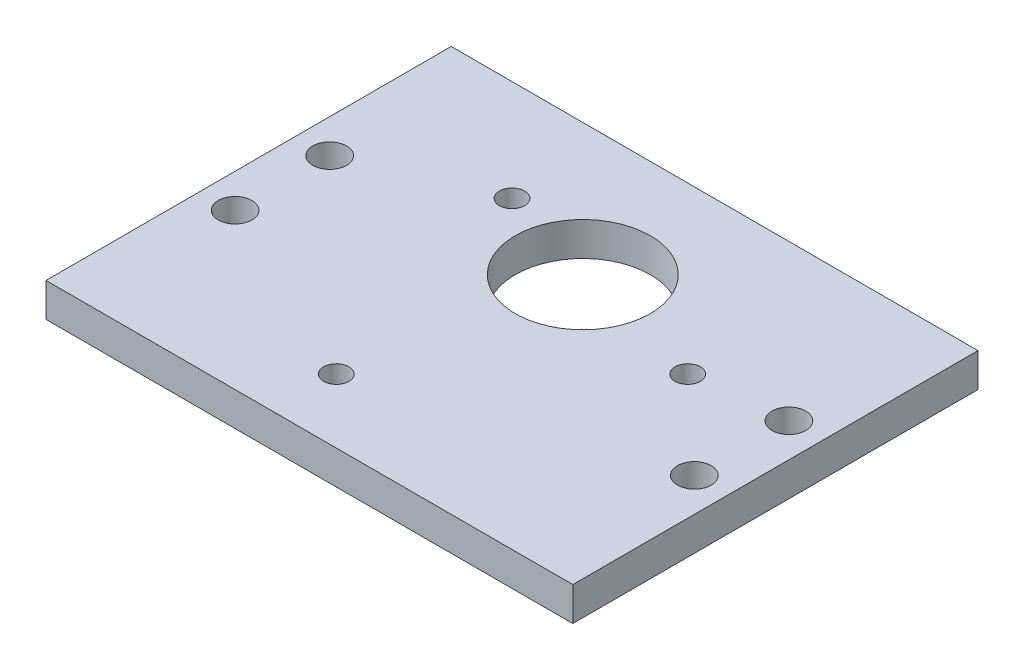
ISO-10303-21;
HEADER;
FILE_DESCRIPTION(('STEP AP214'),'2;1');
FILE_NAME('part.step','',(''),(''),'','','');
FILE_SCHEMA(('AUTOMOTIVE_DESIGN { 1 0 10303 214 1 1 1 1 }'));
ENDSEC;
DATA;
#1=APPLICATION_CONTEXT('core data for automotive mechanical design processes');
#2=APPLICATION_PROTOCOL_DEFINITION('international standard','automotive_design',2000,#1);
#3=PRODUCT_CONTEXT('',#1,'mechanical');
#4=PRODUCT('Part','Part','',(#3));
#5=PRODUCT_RELATED_PRODUCT_CATEGORY('part','',(#4));
#6=PRODUCT_DEFINITION_FORMATION('','',#4);
#7=PRODUCT_DEFINITION_CONTEXT('part definition',#1,'design');
#8=PRODUCT_DEFINITION('design','',#6,#7);
#9=PRODUCT_DEFINITION_SHAPE('','',#8);
#10=(LENGTH_UNIT() NAMED_UNIT(*) SI_UNIT(.MILLI.,.METRE.));
#11=(NAMED_UNIT(*) PLANE_ANGLE_UNIT() SI_UNIT($,.RADIAN.));
#12=(NAMED_UNIT(*) SI_UNIT($,.STERADIAN.) SOLID_ANGLE_UNIT());
#13=UNCERTAINTY_MEASURE_WITH_UNIT(LENGTH_MEASURE(1.E-05),#10,'distance_accuracy_value','');
#14=(GEOMETRIC_REPRESENTATION_CONTEXT(3) GLOBAL_UNCERTAINTY_ASSIGNED_CONTEXT((#13)) GLOBAL_UNIT_ASSIGNED_CONTEXT((#10,
#11,#12)) REPRESENTATION_CONTEXT('',''));
#15=CARTESIAN_POINT('',(0.,0.,0.));
#16=DIRECTION('',(0.,0.,1.));
#17=DIRECTION('',(1.,0.,0.));
#18=AXIS2_PLACEMENT_3D('',#15,#16,#17);
#19=CARTESIAN_POINT('',(0.,3.175,0.));
#20=DIRECTION('',(1.,0.,0.));
#21=DIRECTION('',(0.,0.,-1.));
#22=AXIS2_PLACEMENT_3D('',#19,#20,#21);
#23=PLANE('',#22);
#24=DIRECTION('',(0.,0.,1.));
#25=VECTOR('',#24,1.);
#26=CARTESIAN_POINT('',(0.,0.,0.));
#27=LINE('',#26,#25);
#28=CARTESIAN_POINT('',(0.,0.,-38.1));
#29=VERTEX_POINT('',#28);
#30=CARTESIAN_POINT('',(0.,0.,0.));
#31=VERTEX_POINT('',#30);
#32=EDGE_CURVE('E107',#29,#31,#27,.T.);
#33=ORIENTED_EDGE('',*,*,#32,.T.);
#34=DIRECTION('',(0.,-1.,0.));
#35=VECTOR('',#34,1.);
#36=CARTESIAN_POINT('',(0.,3.175,0.));
#37=LINE('',#36,#35);
#38=CARTESIAN_POINT('',(0.,3.175,0.));
#39=VERTEX_POINT('',#38);
#40=EDGE_CURVE('E13',#39,#31,#37,.T.);
#41=ORIENTED_EDGE('',*,*,#40,.F.);
#42=DIRECTION('',(0.,0.,1.));
#43=VECTOR('',#42,1.);
#44=CARTESIAN_POINT('',(0.,3.175,0.));
#45=LINE('',#44,#43);
#46=CARTESIAN_POINT('',(0.,3.175,-38.1));
#47=VERTEX_POINT('',#46);
#48=EDGE_CURVE('E95',#47,#39,#45,.T.);
#49=ORIENTED_EDGE('',*,*,#48,.F.);
#50=DIRECTION('',(0.,-1.,0.));
#51=VECTOR('',#50,1.);
#52=CARTESIAN_POINT('',(0.,3.175,-38.1));
#53=LINE('',#52,#51);
#54=EDGE_CURVE('E103',#47,#29,#53,.T.);
#55=ORIENTED_EDGE('',*,*,#54,.T.);
#56=EDGE_LOOP('',(#33,#41,#49,#55));
#57=FACE_BOUND('',#56,.T.);
#58=ADVANCED_FACE('F44',(#57),#23,.F.);
#59=CARTESIAN_POINT('',(0.,3.175,0.));
#60=DIRECTION('',(0.,0.,-1.));
#61=DIRECTION('',(-1.,0.,0.));
#62=AXIS2_PLACEMENT_3D('',#59,#60,#61);
#63=PLANE('',#62);
#64=DIRECTION('',(1.,0.,0.));
#65=VECTOR('',#64,1.);
#66=CARTESIAN_POINT('',(0.,0.,0.));
#67=LINE('',#66,#65);
#68=CARTESIAN_POINT('',(49.53,0.,0.));
#69=VERTEX_POINT('',#68);
#70=EDGE_CURVE('E99',#31,#69,#67,.T.);
#71=ORIENTED_EDGE('',*,*,#70,.T.);
#72=DIRECTION('',(0.,-1.,0.));
#73=VECTOR('',#72,1.);
#74=CARTESIAN_POINT('',(49.53,3.175,0.));
#75=LINE('',#74,#73);
#76=CARTESIAN_POINT('',(49.53,3.175,0.));
#77=VERTEX_POINT('',#76);
#78=EDGE_CURVE('E52',#77,#69,#75,.T.);
#79=ORIENTED_EDGE('',*,*,#78,.F.);
#80=DIRECTION('',(1.,0.,0.));
#81=VECTOR('',#80,1.);
#82=CARTESIAN_POINT('',(0.,3.175,0.));
#83=LINE('',#82,#81);
#84=EDGE_CURVE('E90',#39,#77,#83,.T.);
#85=ORIENTED_EDGE('',*,*,#84,.F.);
#86=ORIENTED_EDGE('',*,*,#40,.T.);
#87=EDGE_LOOP('',(#71,#79,#85,#86));
#88=FACE_BOUND('',#87,.T.);
#89=ADVANCED_FACE('F98',(#88),#63,.F.);
#90=CARTESIAN_POINT('',(49.53,3.175,0.));
#91=DIRECTION('',(-1.,0.,0.));
#92=DIRECTION('',(0.,0.,1.));
#93=AXIS2_PLACEMENT_3D('',#90,#91,#92);
#94=PLANE('',#93);
#95=DIRECTION('',(0.,0.,-1.));
#96=VECTOR('',#95,1.);
#97=CARTESIAN_POINT('',(49.53,0.,0.));
#98=LINE('',#97,#96);
#99=CARTESIAN_POINT('',(49.53,0.,-38.1));
#100=VERTEX_POINT('',#99);
#101=EDGE_CURVE('E77',#69,#100,#98,.T.);
#102=ORIENTED_EDGE('',*,*,#101,.T.);
#103=DIRECTION('',(0.,-1.,0.));
#104=VECTOR('',#103,1.);
#105=CARTESIAN_POINT('',(49.53,3.175,-38.1));
#106=LINE('',#105,#104);
#107=CARTESIAN_POINT('',(49.53,3.175,-38.1));
#108=VERTEX_POINT('',#107);
#109=EDGE_CURVE('E100',#108,#100,#106,.T.);
#110=ORIENTED_EDGE('',*,*,#109,.F.);
#111=DIRECTION('',(0.,0.,-1.));
#112=VECTOR('',#111,1.);
#113=CARTESIAN_POINT('',(49.53,3.175,0.));
#114=LINE('',#113,#112);
#115=EDGE_CURVE('E93',#77,#108,#114,.T.);
#116=ORIENTED_EDGE('',*,*,#115,.F.);
#117=ORIENTED_EDGE('',*,*,#78,.T.);
#118=EDGE_LOOP('',(#102,#110,#116,#117));
#119=FACE_BOUND('',#118,.T.);
#120=ADVANCED_FACE('F101',(#119),#94,.F.);
#121=CARTESIAN_POINT('',(0.,3.175,-38.1));
#122=DIRECTION('',(0.,0.,1.));
#123=DIRECTION('',(1.,0.,0.));
#124=AXIS2_PLACEMENT_3D('',#121,#122,#123);
#125=PLANE('',#124);
#126=DIRECTION('',(-1.,0.,0.));
#127=VECTOR('',#126,1.);
#128=CARTESIAN_POINT('',(0.,0.,-38.1));
#129=LINE('',#128,#127);
#130=EDGE_CURVE('E83',#100,#29,#129,.T.);
#131=ORIENTED_EDGE('',*,*,#130,.T.);
#132=ORIENTED_EDGE('',*,*,#54,.F.);
#133=DIRECTION('',(-1.,0.,0.));
#134=VECTOR('',#133,1.);
#135=CARTESIAN_POINT('',(0.,3.175,-38.1));
#136=LINE('',#135,#134);
#137=EDGE_CURVE('E60',#108,#47,#136,.T.);
#138=ORIENTED_EDGE('',*,*,#137,.F.);
#139=ORIENTED_EDGE('',*,*,#109,.T.);
#140=EDGE_LOOP('',(#131,#132,#138,#139));
#141=FACE_BOUND('',#140,.T.);
#142=ADVANCED_FACE('F115',(#141),#125,.F.);
#143=CARTESIAN_POINT('',(0.,3.175,0.));
#144=DIRECTION('',(0.,-1.,0.));
#145=DIRECTION('',(0.,0.,-1.));
#146=AXIS2_PLACEMENT_3D('',#143,#144,#145);
#147=PLANE('',#146);
#148=CARTESIAN_POINT('',(46.355,3.175,-23.495));
#149=DIRECTION('',(0.,-1.,0.));
#150=DIRECTION('',(0.,0.,1.));
#151=AXIS2_PLACEMENT_3D('',#148,#149,#150);
#152=CIRCLE('',#151,1.5875);
#153=CARTESIAN_POINT('',(46.355,3.175,-21.9075));
#154=VERTEX_POINT('',#153);
#155=EDGE_CURVE('E160',#154,#154,#152,.T.);
#156=ORIENTED_EDGE('',*,*,#155,.T.);
#157=EDGE_LOOP('',(#156));
#158=FACE_BOUND('',#157,.T.);
#159=CARTESIAN_POINT('',(46.355,3.175,-14.605));
#160=DIRECTION('',(0.,-1.,0.));
#161=DIRECTION('',(0.,0.,-1.));
#162=AXIS2_PLACEMENT_3D('',#159,#160,#161);
#163=CIRCLE('',#162,1.5875);
#164=CARTESIAN_POINT('',(46.355,3.175,-16.1925));
#165=VERTEX_POINT('',#164);
#166=EDGE_CURVE('E154',#165,#165,#163,.T.);
#167=ORIENTED_EDGE('',*,*,#166,.T.);
#168=EDGE_LOOP('',(#167));
#169=FACE_BOUND('',#168,.T.);
#170=CARTESIAN_POINT('',(3.175,3.175,-14.605));
#171=DIRECTION('',(0.,-1.,0.));
#172=DIRECTION('',(0.,0.,1.));
#173=AXIS2_PLACEMENT_3D('',#170,#171,#172);
#174=CIRCLE('',#173,1.5875);
#175=CARTESIAN_POINT('',(3.175,3.175,-13.0175));
#176=VERTEX_POINT('',#175);
#177=EDGE_CURVE('E148',#176,#176,#174,.T.);
#178=ORIENTED_EDGE('',*,*,#177,.T.);
#179=EDGE_LOOP('',(#178));
#180=FACE_BOUND('',#179,.T.);
#181=CARTESIAN_POINT('',(3.175,3.175,-23.495));
#182=DIRECTION('',(0.,-1.,0.));
#183=DIRECTION('',(0.,0.,-1.));
#184=AXIS2_PLACEMENT_3D('',#181,#182,#183);
#185=CIRCLE('',#184,1.5875);
#186=CARTESIAN_POINT('',(3.175,3.175,-25.0825));
#187=VERTEX_POINT('',#186);
#188=EDGE_CURVE('E142',#187,#187,#185,.T.);
#189=ORIENTED_EDGE('',*,*,#188,.T.);
#190=EDGE_LOOP('',(#189));
#191=FACE_BOUND('',#190,.T.);
#192=CARTESIAN_POINT('',(15.2279679994246,3.175,-28.5870320005755));
#193=DIRECTION('',(0.,-1.,0.));
#194=DIRECTION('',(0.,0.,-1.));
#195=AXIS2_PLACEMENT_3D('',#192,#193,#194);
#196=CIRCLE('',#195,1.190625);
#197=CARTESIAN_POINT('',(15.2279679994246,3.175,-29.7776570005754));
#198=VERTEX_POINT('',#197);
#199=EDGE_CURVE('E136',#198,#198,#196,.T.);
#200=ORIENTED_EDGE('',*,*,#199,.T.);
#201=EDGE_LOOP('',(#200));
#202=FACE_BOUND('',#201,.T.);
#203=CARTESIAN_POINT('',(37.7928279894912,3.175,-22.5407959889157));
#204=DIRECTION('',(0.,-1.,0.));
#205=DIRECTION('',(0.,0.,-1.));
#206=AXIS2_PLACEMENT_3D('',#203,#204,#205);
#207=CIRCLE('',#206,1.190625);
#208=CARTESIAN_POINT('',(37.7928279894912,3.175,-23.7314209889157));
#209=VERTEX_POINT('',#208);
#210=EDGE_CURVE('E130',#209,#209,#207,.T.);
#211=ORIENTED_EDGE('',*,*,#210,.T.);
#212=EDGE_LOOP('',(#211));
#213=FACE_BOUND('',#212,.T.);
#214=CARTESIAN_POINT('',(24.765,3.175,-25.7048));
#215=DIRECTION('',(0.,-1.,0.));
#216=DIRECTION('',(0.,0.,-1.));
#217=AXIS2_PLACEMENT_3D('',#214,#215,#216);
#218=CIRCLE('',#217,6.35);
#219=CARTESIAN_POINT('',(24.765,3.175,-32.0548));
#220=VERTEX_POINT('',#219);
#221=EDGE_CURVE('E124',#220,#220,#218,.T.);
#222=ORIENTED_EDGE('',*,*,#221,.T.);
#223=EDGE_LOOP('',(#222));
#224=FACE_BOUND('',#223,.T.);
#225=CARTESIAN_POINT('',(21.2742040110843,3.175,-6.02217201050882));
#226=DIRECTION('',(0.,-1.,0.));
#227=DIRECTION('',(0.,0.,-1.));
#228=AXIS2_PLACEMENT_3D('',#225,#226,#227);
#229=CIRCLE('',#228,1.190625);
#230=CARTESIAN_POINT('',(21.2742040110843,3.175,-7.21279701050882));
#231=VERTEX_POINT('',#230);
#232=EDGE_CURVE('E110',#231,#231,#229,.T.);
#233=ORIENTED_EDGE('',*,*,#232,.T.);
#234=EDGE_LOOP('',(#233));
#235=FACE_BOUND('',#234,.T.);
#236=ORIENTED_EDGE('',*,*,#48,.T.);
#237=ORIENTED_EDGE('',*,*,#84,.T.);
#238=ORIENTED_EDGE('',*,*,#115,.T.);
#239=ORIENTED_EDGE('',*,*,#137,.T.);
#240=EDGE_LOOP('',(#236,#237,#238,#239));
#241=FACE_BOUND('',#240,.T.);
#242=ADVANCED_FACE('F91',(#158,#169,#180,#191,#202,#213,#224,#235,#241),#147,.F.);
#243=CARTESIAN_POINT('',(0.,0.,0.));
#244=DIRECTION('',(0.,-1.,0.));
#245=DIRECTION('',(0.,0.,-1.));
#246=AXIS2_PLACEMENT_3D('',#243,#244,#245);
#247=PLANE('',#246);
#248=CARTESIAN_POINT('',(46.355,0.,-23.495));
#249=DIRECTION('',(0.,-1.,0.));
#250=DIRECTION('',(0.,0.,1.));
#251=AXIS2_PLACEMENT_3D('',#248,#249,#250);
#252=CIRCLE('',#251,1.5875);
#253=CARTESIAN_POINT('',(46.355,0.,-21.9075));
#254=VERTEX_POINT('',#253);
#255=EDGE_CURVE('E163',#254,#254,#252,.T.);
#256=ORIENTED_EDGE('',*,*,#255,.F.);
#257=EDGE_LOOP('',(#256));
#258=FACE_BOUND('',#257,.T.);
#259=CARTESIAN_POINT('',(46.355,0.,-14.605));
#260=DIRECTION('',(0.,-1.,0.));
#261=DIRECTION('',(0.,0.,-1.));
#262=AXIS2_PLACEMENT_3D('',#259,#260,#261);
#263=CIRCLE('',#262,1.5875);
#264=CARTESIAN_POINT('',(46.355,0.,-16.1925));
#265=VERTEX_POINT('',#264);
#266=EDGE_CURVE('E157',#265,#265,#263,.T.);
#267=ORIENTED_EDGE('',*,*,#266,.F.);
#268=EDGE_LOOP('',(#267));
#269=FACE_BOUND('',#268,.T.);
#270=CARTESIAN_POINT('',(3.175,0.,-14.605));
#271=DIRECTION('',(0.,-1.,0.));
#272=DIRECTION('',(0.,0.,1.));
#273=AXIS2_PLACEMENT_3D('',#270,#271,#272);
#274=CIRCLE('',#273,1.5875);
#275=CARTESIAN_POINT('',(3.175,0.,-13.0175));
#276=VERTEX_POINT('',#275);
#277=EDGE_CURVE('E151',#276,#276,#274,.T.);
#278=ORIENTED_EDGE('',*,*,#277,.F.);
#279=EDGE_LOOP('',(#278));
#280=FACE_BOUND('',#279,.T.);
#281=CARTESIAN_POINT('',(3.175,0.,-23.495));
#282=DIRECTION('',(0.,-1.,0.));
#283=DIRECTION('',(0.,0.,-1.));
#284=AXIS2_PLACEMENT_3D('',#281,#282,#283);
#285=CIRCLE('',#284,1.5875);
#286=CARTESIAN_POINT('',(3.175,0.,-25.0825));
#287=VERTEX_POINT('',#286);
#288=EDGE_CURVE('E145',#287,#287,#285,.T.);
#289=ORIENTED_EDGE('',*,*,#288,.F.);
#290=EDGE_LOOP('',(#289));
#291=FACE_BOUND('',#290,.T.);
#292=CARTESIAN_POINT('',(15.2279679994246,0.,-28.5870320005755));
#293=DIRECTION('',(0.,-1.,0.));
#294=DIRECTION('',(0.,0.,-1.));
#295=AXIS2_PLACEMENT_3D('',#292,#293,#294);
#296=CIRCLE('',#295,1.190625);
#297=CARTESIAN_POINT('',(15.2279679994246,0.,-29.7776570005754));
#298=VERTEX_POINT('',#297);
#299=EDGE_CURVE('E139',#298,#298,#296,.T.);
#300=ORIENTED_EDGE('',*,*,#299,.F.);
#301=EDGE_LOOP('',(#300));
#302=FACE_BOUND('',#301,.T.);
#303=CARTESIAN_POINT('',(37.7928279894912,0.,-22.5407959889157));
#304=DIRECTION('',(0.,-1.,0.));
#305=DIRECTION('',(0.,0.,-1.));
#306=AXIS2_PLACEMENT_3D('',#303,#304,#305);
#307=CIRCLE('',#306,1.190625);
#308=CARTESIAN_POINT('',(37.7928279894912,0.,-23.7314209889157));
#309=VERTEX_POINT('',#308);
#310=EDGE_CURVE('E133',#309,#309,#307,.T.);
#311=ORIENTED_EDGE('',*,*,#310,.F.);
#312=EDGE_LOOP('',(#311));
#313=FACE_BOUND('',#312,.T.);
#314=CARTESIAN_POINT('',(24.765,0.,-25.7048));
#315=DIRECTION('',(0.,-1.,0.));
#316=DIRECTION('',(0.,0.,-1.));
#317=AXIS2_PLACEMENT_3D('',#314,#315,#316);
#318=CIRCLE('',#317,6.35);
#319=CARTESIAN_POINT('',(24.765,0.,-32.0548));
#320=VERTEX_POINT('',#319);
#321=EDGE_CURVE('E127',#320,#320,#318,.T.);
#322=ORIENTED_EDGE('',*,*,#321,.F.);
#323=EDGE_LOOP('',(#322));
#324=FACE_BOUND('',#323,.T.);
#325=CARTESIAN_POINT('',(21.2742040110843,0.,-6.02217201050882));
#326=DIRECTION('',(0.,-1.,0.));
#327=DIRECTION('',(0.,0.,-1.));
#328=AXIS2_PLACEMENT_3D('',#325,#326,#327);
#329=CIRCLE('',#328,1.190625);
#330=CARTESIAN_POINT('',(21.2742040110843,0.,-7.21279701050882));
#331=VERTEX_POINT('',#330);
#332=EDGE_CURVE('E121',#331,#331,#329,.T.);
#333=ORIENTED_EDGE('',*,*,#332,.F.);
#334=EDGE_LOOP('',(#333));
#335=FACE_BOUND('',#334,.T.);
#336=ORIENTED_EDGE('',*,*,#32,.F.);
#337=ORIENTED_EDGE('',*,*,#130,.F.);
#338=ORIENTED_EDGE('',*,*,#101,.F.);
#339=ORIENTED_EDGE('',*,*,#70,.F.);
#340=EDGE_LOOP('',(#336,#337,#338,#339));
#341=FACE_BOUND('',#340,.T.);
#342=ADVANCED_FACE('F118',(#258,#269,#280,#291,#302,#313,#324,#335,#341),#247,.T.);
#343=CARTESIAN_POINT('',(21.2742040110843,3.175,-6.02217201050882));
#344=DIRECTION('',(0.,-1.,0.));
#345=DIRECTION('',(0.,0.,-1.));
#346=AXIS2_PLACEMENT_3D('',#343,#344,#345);
#347=CYLINDRICAL_SURFACE('',#346,1.190625);
#348=ORIENTED_EDGE('',*,*,#232,.F.);
#349=EDGE_LOOP('',(#348));
#350=FACE_BOUND('',#349,.T.);
#351=ORIENTED_EDGE('',*,*,#332,.T.);
#352=EDGE_LOOP('',(#351));
#353=FACE_BOUND('',#352,.T.);
#354=ADVANCED_FACE('F180',(#350,#353),#347,.F.);
#355=CARTESIAN_POINT('',(24.765,3.175,-25.7048));
#356=DIRECTION('',(0.,-1.,0.));
#357=DIRECTION('',(0.,0.,-1.));
#358=AXIS2_PLACEMENT_3D('',#355,#356,#357);
#359=CYLINDRICAL_SURFACE('',#358,6.35);
#360=ORIENTED_EDGE('',*,*,#221,.F.);
#361=EDGE_LOOP('',(#360));
#362=FACE_BOUND('',#361,.T.);
#363=ORIENTED_EDGE('',*,*,#321,.T.);
#364=EDGE_LOOP('',(#363));
#365=FACE_BOUND('',#364,.T.);
#366=ADVANCED_FACE('F197',(#362,#365),#359,.F.);
#367=CARTESIAN_POINT('',(37.7928279894912,3.175,-22.5407959889157));
#368=DIRECTION('',(0.,-1.,0.));
#369=DIRECTION('',(0.,0.,-1.));
#370=AXIS2_PLACEMENT_3D('',#367,#368,#369);
#371=CYLINDRICAL_SURFACE('',#370,1.190625);
#372=ORIENTED_EDGE('',*,*,#210,.F.);
#373=EDGE_LOOP('',(#372));
#374=FACE_BOUND('',#373,.T.);
#375=ORIENTED_EDGE('',*,*,#310,.T.);
#376=EDGE_LOOP('',(#375));
#377=FACE_BOUND('',#376,.T.);
#378=ADVANCED_FACE('F203',(#374,#377),#371,.F.);
#379=CARTESIAN_POINT('',(15.2279679994246,3.175,-28.5870320005755));
#380=DIRECTION('',(0.,-1.,0.));
#381=DIRECTION('',(0.,0.,-1.));
#382=AXIS2_PLACEMENT_3D('',#379,#380,#381);
#383=CYLINDRICAL_SURFACE('',#382,1.190625);
#384=ORIENTED_EDGE('',*,*,#199,.F.);
#385=EDGE_LOOP('',(#384));
#386=FACE_BOUND('',#385,.T.);
#387=ORIENTED_EDGE('',*,*,#299,.T.);
#388=EDGE_LOOP('',(#387));
#389=FACE_BOUND('',#388,.T.);
#390=ADVANCED_FACE('F246',(#386,#389),#383,.F.);
#391=CARTESIAN_POINT('',(3.175,3.175,-23.495));
#392=DIRECTION('',(0.,-1.,0.));
#393=DIRECTION('',(0.,0.,-1.));
#394=AXIS2_PLACEMENT_3D('',#391,#392,#393);
#395=CYLINDRICAL_SURFACE('',#394,1.5875);
#396=ORIENTED_EDGE('',*,*,#188,.F.);
#397=EDGE_LOOP('',(#396));
#398=FACE_BOUND('',#397,.T.);
#399=ORIENTED_EDGE('',*,*,#288,.T.);
#400=EDGE_LOOP('',(#399));
#401=FACE_BOUND('',#400,.T.);
#402=ADVANCED_FACE('F256',(#398,#401),#395,.F.);
#403=CARTESIAN_POINT('',(3.175,3.175,-14.605));
#404=DIRECTION('',(0.,-1.,0.));
#405=DIRECTION('',(0.,0.,-1.));
#406=AXIS2_PLACEMENT_3D('',#403,#404,#405);
#407=CYLINDRICAL_SURFACE('',#406,1.5875);
#408=ORIENTED_EDGE('',*,*,#177,.F.);
#409=EDGE_LOOP('',(#408));
#410=FACE_BOUND('',#409,.T.);
#411=ORIENTED_EDGE('',*,*,#277,.T.);
#412=EDGE_LOOP('',(#411));
#413=FACE_BOUND('',#412,.T.);
#414=ADVANCED_FACE('F266',(#410,#413),#407,.F.);
#415=CARTESIAN_POINT('',(46.355,3.175,-14.605));
#416=DIRECTION('',(0.,-1.,0.));
#417=DIRECTION('',(0.,0.,-1.));
#418=AXIS2_PLACEMENT_3D('',#415,#416,#417);
#419=CYLINDRICAL_SURFACE('',#418,1.5875);
#420=ORIENTED_EDGE('',*,*,#166,.F.);
#421=EDGE_LOOP('',(#420));
#422=FACE_BOUND('',#421,.T.);
#423=ORIENTED_EDGE('',*,*,#266,.T.);
#424=EDGE_LOOP('',(#423));
#425=FACE_BOUND('',#424,.T.);
#426=ADVANCED_FACE('F174',(#422,#425),#419,.F.);
#427=CARTESIAN_POINT('',(46.355,3.175,-23.495));
#428=DIRECTION('',(0.,-1.,0.));
#429=DIRECTION('',(0.,0.,-1.));
#430=AXIS2_PLACEMENT_3D('',#427,#428,#429);
#431=CYLINDRICAL_SURFACE('',#430,1.5875);
#432=ORIENTED_EDGE('',*,*,#155,.F.);
#433=EDGE_LOOP('',(#432));
#434=FACE_BOUND('',#433,.T.);
#435=ORIENTED_EDGE('',*,*,#255,.T.);
#436=EDGE_LOOP('',(#435));
#437=FACE_BOUND('',#436,.T.);
#438=ADVANCED_FACE('F171',(#434,#437),#431,.F.);
#439=CLOSED_SHELL('',(#58,#89,#120,#142,#242,#342,#354,#366,#378,#390,#402,#414,#426,#438));
#440=MANIFOLD_SOLID_BREP('B2',#439);
#441=ADVANCED_BREP_SHAPE_REPRESENTATION('',(#18,#440),#14);
#442=SHAPE_DEFINITION_REPRESENTATION(#9,#441);
ENDSEC;
END-ISO-10303-21;
